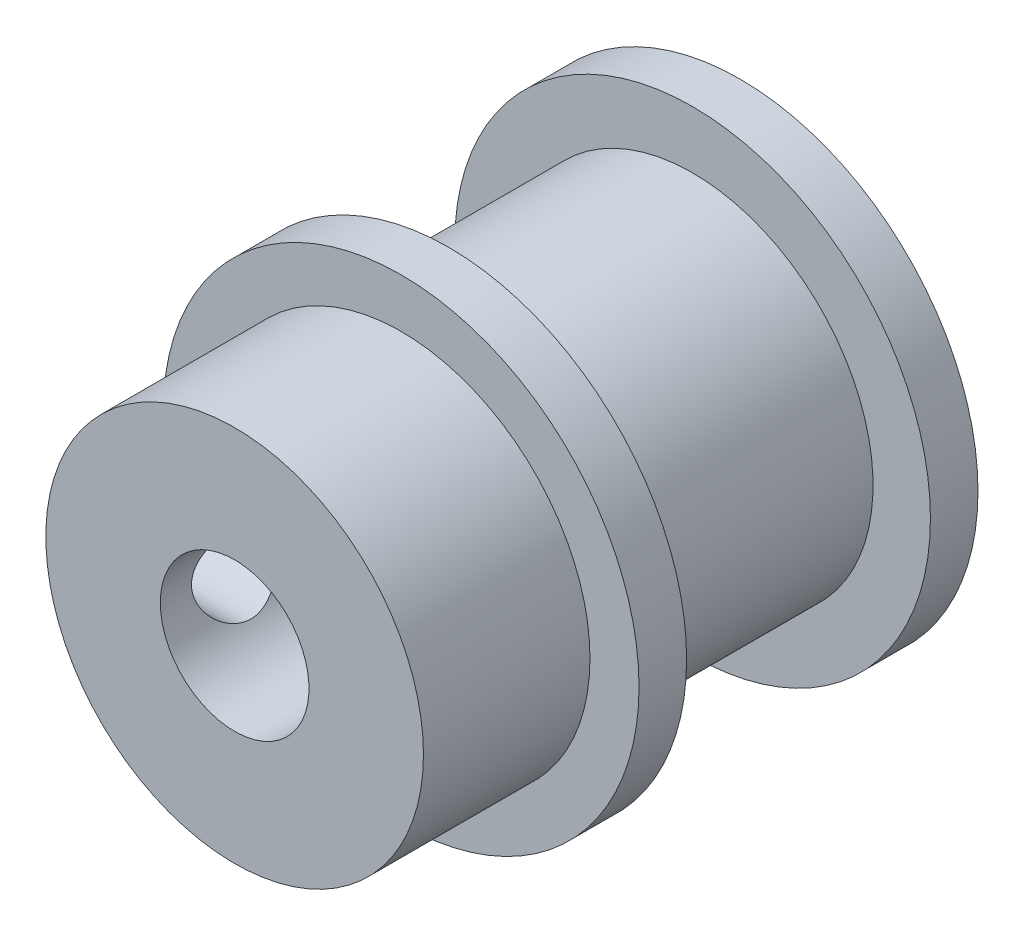
ISO-10303-21;
HEADER;
FILE_DESCRIPTION(('STEP AP214'),'2;1');
FILE_NAME('part.step','',(''),(''),'','','');
FILE_SCHEMA(('AUTOMOTIVE_DESIGN { 1 0 10303 214 1 1 1 1 }'));
ENDSEC;
DATA;
#1=APPLICATION_CONTEXT('core data for automotive mechanical design processes');
#2=APPLICATION_PROTOCOL_DEFINITION('international standard','automotive_design',2000,#1);
#3=PRODUCT_CONTEXT('',#1,'mechanical');
#4=PRODUCT('Part','Part','',(#3));
#5=PRODUCT_RELATED_PRODUCT_CATEGORY('part','',(#4));
#6=PRODUCT_DEFINITION_FORMATION('','',#4);
#7=PRODUCT_DEFINITION_CONTEXT('part definition',#1,'design');
#8=PRODUCT_DEFINITION('design','',#6,#7);
#9=PRODUCT_DEFINITION_SHAPE('','',#8);
#10=(LENGTH_UNIT() NAMED_UNIT(*) SI_UNIT(.MILLI.,.METRE.));
#11=(NAMED_UNIT(*) PLANE_ANGLE_UNIT() SI_UNIT($,.RADIAN.));
#12=(NAMED_UNIT(*) SI_UNIT($,.STERADIAN.) SOLID_ANGLE_UNIT());
#13=UNCERTAINTY_MEASURE_WITH_UNIT(LENGTH_MEASURE(1.E-05),#10,'distance_accuracy_value','');
#14=(GEOMETRIC_REPRESENTATION_CONTEXT(3) GLOBAL_UNCERTAINTY_ASSIGNED_CONTEXT((#13)) GLOBAL_UNIT_ASSIGNED_CONTEXT((#10,
#11,#12)) REPRESENTATION_CONTEXT('',''));
#15=CARTESIAN_POINT('',(0.,0.,0.));
#16=DIRECTION('',(0.,0.,1.));
#17=DIRECTION('',(1.,0.,0.));
#18=AXIS2_PLACEMENT_3D('',#15,#16,#17);
#19=CARTESIAN_POINT('',(0.,0.,11.4));
#20=DIRECTION('',(0.,0.,1.));
#21=DIRECTION('',(1.,0.,0.));
#22=AXIS2_PLACEMENT_3D('',#19,#20,#21);
#23=PLANE('',#22);
#24=CARTESIAN_POINT('',(0.,0.,11.4));
#25=DIRECTION('',(0.,0.,1.));
#26=DIRECTION('',(1.,0.,0.));
#27=AXIS2_PLACEMENT_3D('',#24,#25,#26);
#28=CIRCLE('',#27,8.);
#29=CARTESIAN_POINT('',(8.,0.,11.4));
#30=VERTEX_POINT('',#29);
#31=EDGE_CURVE('E38',#30,#30,#28,.T.);
#32=ORIENTED_EDGE('',*,*,#31,.T.);
#33=EDGE_LOOP('',(#32));
#34=FACE_BOUND('',#33,.T.);
#35=CARTESIAN_POINT('',(0.,0.,11.4));
#36=DIRECTION('',(0.,0.,1.));
#37=DIRECTION('',(1.,0.,0.));
#38=AXIS2_PLACEMENT_3D('',#35,#36,#37);
#39=CIRCLE('',#38,6.35);
#40=CARTESIAN_POINT('',(6.35,0.,11.4));
#41=VERTEX_POINT('',#40);
#42=EDGE_CURVE('E58',#41,#41,#39,.T.);
#43=ORIENTED_EDGE('',*,*,#42,.F.);
#44=EDGE_LOOP('',(#43));
#45=FACE_BOUND('',#44,.T.);
#46=ADVANCED_FACE('F31',(#34,#45),#23,.T.);
#47=CARTESIAN_POINT('',(8.,0.,9.8));
#48=DIRECTION('',(0.,0.,-1.));
#49=DIRECTION('',(-1.,0.,0.));
#50=AXIS2_PLACEMENT_3D('',#47,#48,#49);
#51=PLANE('',#50);
#52=CARTESIAN_POINT('',(0.,0.,9.8));
#53=DIRECTION('',(0.,0.,1.));
#54=DIRECTION('',(1.,0.,0.));
#55=AXIS2_PLACEMENT_3D('',#52,#53,#54);
#56=CIRCLE('',#55,8.);
#57=CARTESIAN_POINT('',(8.,0.,9.8));
#58=VERTEX_POINT('',#57);
#59=EDGE_CURVE('E10',#58,#58,#56,.T.);
#60=ORIENTED_EDGE('',*,*,#59,.F.);
#61=EDGE_LOOP('',(#60));
#62=FACE_BOUND('',#61,.T.);
#63=CARTESIAN_POINT('',(0.,0.,9.8));
#64=DIRECTION('',(0.,0.,-1.));
#65=DIRECTION('',(-1.,0.,0.));
#66=AXIS2_PLACEMENT_3D('',#63,#64,#65);
#67=CIRCLE('',#66,6.07);
#68=CARTESIAN_POINT('',(-6.07,0.,9.8));
#69=VERTEX_POINT('',#68);
#70=EDGE_CURVE('E46',#69,#69,#67,.T.);
#71=ORIENTED_EDGE('',*,*,#70,.F.);
#72=EDGE_LOOP('',(#71));
#73=FACE_BOUND('',#72,.T.);
#74=ADVANCED_FACE('F104',(#62,#73),#51,.T.);
#75=CARTESIAN_POINT('',(0.,0.,9.8));
#76=DIRECTION('',(0.,0.,1.));
#77=DIRECTION('',(1.,0.,0.));
#78=AXIS2_PLACEMENT_3D('',#75,#76,#77);
#79=CYLINDRICAL_SURFACE('',#78,8.);
#80=ORIENTED_EDGE('',*,*,#59,.T.);
#81=EDGE_LOOP('',(#80));
#82=FACE_BOUND('',#81,.T.);
#83=ORIENTED_EDGE('',*,*,#31,.F.);
#84=EDGE_LOOP('',(#83));
#85=FACE_BOUND('',#84,.T.);
#86=ADVANCED_FACE('F33',(#82,#85),#79,.T.);
#87=CARTESIAN_POINT('',(0.,0.,1.6));
#88=DIRECTION('',(0.,0.,1.));
#89=DIRECTION('',(1.,0.,0.));
#90=AXIS2_PLACEMENT_3D('',#87,#88,#89);
#91=CYLINDRICAL_SURFACE('',#90,6.07);
#92=CARTESIAN_POINT('',(0.,0.,1.6));
#93=DIRECTION('',(0.,0.,-1.));
#94=DIRECTION('',(-1.,0.,0.));
#95=AXIS2_PLACEMENT_3D('',#92,#93,#94);
#96=CIRCLE('',#95,6.07);
#97=CARTESIAN_POINT('',(-6.07,0.,1.6));
#98=VERTEX_POINT('',#97);
#99=EDGE_CURVE('E42',#98,#98,#96,.T.);
#100=ORIENTED_EDGE('',*,*,#99,.F.);
#101=EDGE_LOOP('',(#100));
#102=FACE_BOUND('',#101,.T.);
#103=ORIENTED_EDGE('',*,*,#70,.T.);
#104=EDGE_LOOP('',(#103));
#105=FACE_BOUND('',#104,.T.);
#106=ADVANCED_FACE('F112',(#102,#105),#91,.T.);
#107=CARTESIAN_POINT('',(0.,0.,1.6));
#108=DIRECTION('',(0.,0.,-1.));
#109=DIRECTION('',(-1.,0.,0.));
#110=AXIS2_PLACEMENT_3D('',#107,#108,#109);
#111=PLANE('',#110);
#112=CARTESIAN_POINT('',(0.,0.,1.6));
#113=DIRECTION('',(0.,0.,1.));
#114=DIRECTION('',(-1.,0.,0.));
#115=AXIS2_PLACEMENT_3D('',#112,#113,#114);
#116=CIRCLE('',#115,8.);
#117=CARTESIAN_POINT('',(-8.,0.,1.6));
#118=VERTEX_POINT('',#117);
#119=EDGE_CURVE('E52',#118,#118,#116,.T.);
#120=ORIENTED_EDGE('',*,*,#119,.T.);
#121=EDGE_LOOP('',(#120));
#122=FACE_BOUND('',#121,.T.);
#123=ORIENTED_EDGE('',*,*,#99,.T.);
#124=EDGE_LOOP('',(#123));
#125=FACE_BOUND('',#124,.T.);
#126=ADVANCED_FACE('F115',(#122,#125),#111,.F.);
#127=CARTESIAN_POINT('',(0.,0.,0.));
#128=DIRECTION('',(0.,0.,1.));
#129=DIRECTION('',(1.,0.,0.));
#130=AXIS2_PLACEMENT_3D('',#127,#128,#129);
#131=CYLINDRICAL_SURFACE('',#130,8.);
#132=CARTESIAN_POINT('',(0.,0.,0.));
#133=DIRECTION('',(0.,0.,1.));
#134=DIRECTION('',(-1.,0.,0.));
#135=AXIS2_PLACEMENT_3D('',#132,#133,#134);
#136=CIRCLE('',#135,8.);
#137=CARTESIAN_POINT('',(-8.,0.,0.));
#138=VERTEX_POINT('',#137);
#139=EDGE_CURVE('E50',#138,#138,#136,.T.);
#140=ORIENTED_EDGE('',*,*,#139,.T.);
#141=EDGE_LOOP('',(#140));
#142=FACE_BOUND('',#141,.T.);
#143=ORIENTED_EDGE('',*,*,#119,.F.);
#144=EDGE_LOOP('',(#143));
#145=FACE_BOUND('',#144,.T.);
#146=ADVANCED_FACE('F117',(#142,#145),#131,.T.);
#147=CARTESIAN_POINT('',(0.,0.,0.));
#148=DIRECTION('',(0.,0.,-1.));
#149=DIRECTION('',(-1.,0.,0.));
#150=AXIS2_PLACEMENT_3D('',#147,#148,#149);
#151=PLANE('',#150);
#152=CARTESIAN_POINT('',(0.,0.,0.));
#153=DIRECTION('',(0.,0.,-1.));
#154=DIRECTION('',(-1.,0.,0.));
#155=AXIS2_PLACEMENT_3D('',#152,#153,#154);
#156=CIRCLE('',#155,2.49999999999999);
#157=CARTESIAN_POINT('',(-2.49999999999999,0.,0.));
#158=VERTEX_POINT('',#157);
#159=EDGE_CURVE('E66',#158,#158,#156,.T.);
#160=ORIENTED_EDGE('',*,*,#159,.F.);
#161=EDGE_LOOP('',(#160));
#162=FACE_BOUND('',#161,.T.);
#163=ORIENTED_EDGE('',*,*,#139,.F.);
#164=EDGE_LOOP('',(#163));
#165=FACE_BOUND('',#164,.T.);
#166=ADVANCED_FACE('F100',(#162,#165),#151,.T.);
#167=CARTESIAN_POINT('',(0.,0.,17.));
#168=DIRECTION('',(0.,0.,-1.));
#169=DIRECTION('',(-1.,0.,0.));
#170=AXIS2_PLACEMENT_3D('',#167,#168,#169);
#171=CYLINDRICAL_SURFACE('',#170,6.35);
#172=CARTESIAN_POINT('',(-6.35,0.,15.9528365135193));
#173=CARTESIAN_POINT('',(-6.34999851724395,-0.0830209487421049,15.9528339366377));
#174=CARTESIAN_POINT('',(-6.34835548464635,-0.166071705542504,15.9459208040846));
#175=CARTESIAN_POINT('',(-6.34196006203195,-0.329802616773766,15.9184865242906));
#176=CARTESIAN_POINT('',(-6.33720570059271,-0.410481234262163,15.8979567490638));
#177=CARTESIAN_POINT('',(-6.32511541536286,-0.567078972002022,15.8439772061771));
#178=CARTESIAN_POINT('',(-6.31778241043488,-0.64300335974414,15.8105420424467));
#179=CARTESIAN_POINT('',(-6.3013205537597,-0.788164128517249,15.7317499598303));
#180=CARTESIAN_POINT('',(-6.29219168938457,-0.857400462514774,15.6863929571128));
#181=CARTESIAN_POINT('',(-6.27294410619427,-0.988504146075392,15.5841559740953));
#182=CARTESIAN_POINT('',(-6.26281145281055,-1.05022983067825,15.5270969405367));
#183=CARTESIAN_POINT('',(-6.24279339171246,-1.16333007962071,15.4034594223295));
#184=CARTESIAN_POINT('',(-6.23290800919793,-1.2147035926849,15.3368799720437));
#185=CARTESIAN_POINT('',(-6.21436474587978,-1.30628857858909,15.1950155590712));
#186=CARTESIAN_POINT('',(-6.20572463411779,-1.34634507695963,15.1196280157515));
#187=CARTESIAN_POINT('',(-6.19085199880808,-1.41316353749857,14.9629529123057));
#188=CARTESIAN_POINT('',(-6.18461913528442,-1.43992737714354,14.8816661872495));
#189=CARTESIAN_POINT('',(-6.1754093638889,-1.4789243640839,14.7170486009501));
#190=CARTESIAN_POINT('',(-6.17237584620284,-1.4914104910839,14.6337809072313));
#191=CARTESIAN_POINT('',(-6.16973853210434,-1.50228500188724,14.4662816667529));
#192=CARTESIAN_POINT('',(-6.17013424074105,-1.5006754201675,14.3820502608416));
#193=CARTESIAN_POINT('',(-6.17425961423211,-1.48360683567082,14.2169265525034));
#194=CARTESIAN_POINT('',(-6.17791755158493,-1.4684457767716,14.1360013840218));
#195=CARTESIAN_POINT('',(-6.18804133190497,-1.42517840490093,13.9778767861164));
#196=CARTESIAN_POINT('',(-6.19450735566558,-1.39707125841274,13.9006775969386));
#197=CARTESIAN_POINT('',(-6.20958678218059,-1.32844678458484,13.7513798697232));
#198=CARTESIAN_POINT('',(-6.21821926579501,-1.28781841151537,13.6793343815247));
#199=CARTESIAN_POINT('',(-6.23664776102026,-1.19538261640077,13.5429751507037));
#200=CARTESIAN_POINT('',(-6.24644395581355,-1.14357343330741,13.4786626285598));
#201=CARTESIAN_POINT('',(-6.26640074159939,-1.02868790517089,13.3578837785624));
#202=CARTESIAN_POINT('',(-6.27656427474606,-0.965359229076418,13.3016576832906));
#203=CARTESIAN_POINT('',(-6.29588562944104,-0.830052536460324,13.2005810109286));
#204=CARTESIAN_POINT('',(-6.30504342639666,-0.758074308526314,13.155730711969));
#205=CARTESIAN_POINT('',(-6.32135942493142,-0.607191614109492,13.0786038851033));
#206=CARTESIAN_POINT('',(-6.32851195395597,-0.528268312455402,13.0463629272039));
#207=CARTESIAN_POINT('',(-6.33996993682454,-0.365916560598579,12.9956702108494));
#208=CARTESIAN_POINT('',(-6.34427587535181,-0.282488879965401,12.9772161048651));
#209=CARTESIAN_POINT('',(-6.34948503249582,-0.115553538980352,12.9549798275075));
#210=CARTESIAN_POINT('',(-6.35046421324579,-0.0320918238016502,12.9508700612716));
#211=CARTESIAN_POINT('',(-6.34912429021221,0.134326079532355,12.9565454456191));
#212=CARTESIAN_POINT('',(-6.34680544961474,0.217282307495616,12.9663294874597));
#213=CARTESIAN_POINT('',(-6.33917838174839,0.37922016985958,12.9992438951182));
#214=CARTESIAN_POINT('',(-6.33390950352625,0.458239510996913,13.0221986809419));
#215=CARTESIAN_POINT('',(-6.32097400029951,0.611304086387359,13.0806050138535));
#216=CARTESIAN_POINT('',(-6.31330714919518,0.685348850798215,13.1160577393855));
#217=CARTESIAN_POINT('',(-6.29624149651372,0.827689304318969,13.1991100651196));
#218=CARTESIAN_POINT('',(-6.28681663475878,0.895872345524981,13.2468972492251));
#219=CARTESIAN_POINT('',(-6.26732668110161,1.02336854827638,13.3530189840094));
#220=CARTESIAN_POINT('',(-6.25726149136242,1.08268034970591,13.4113551490085));
#221=CARTESIAN_POINT('',(-6.23735679650375,1.19207580420076,13.5384324966406));
#222=CARTESIAN_POINT('',(-6.22752694929493,1.24193090389247,13.6073722471142));
#223=CARTESIAN_POINT('',(-6.20945265145426,1.32936029211664,13.7528359354712));
#224=CARTESIAN_POINT('',(-6.2012081299286,1.36693512985993,13.8293595339822));
#225=CARTESIAN_POINT('',(-6.18732408481131,1.42846636533289,13.9874008455852));
#226=CARTESIAN_POINT('',(-6.18166930794986,1.45250270111901,14.068886027581));
#227=CARTESIAN_POINT('',(-6.17358371023307,1.48649761919311,14.234892392102));
#228=CARTESIAN_POINT('',(-6.17115227288946,1.49645889346788,14.3194129909035));
#229=CARTESIAN_POINT('',(-6.16983199335337,1.50189189090822,14.4867753920578));
#230=CARTESIAN_POINT('',(-6.17085418392761,1.49772748776162,14.5696048805866));
#231=CARTESIAN_POINT('',(-6.17612233302335,1.47585131759939,14.7333452390736));
#232=CARTESIAN_POINT('',(-6.18036823966433,1.45813976860322,14.8142561398869));
#233=CARTESIAN_POINT('',(-6.19155859321837,1.40986066978044,14.9715155299881));
#234=CARTESIAN_POINT('',(-6.198490161484,1.37935441810503,15.0478838163832));
#235=CARTESIAN_POINT('',(-6.21427398682872,1.30640175172683,15.1944693506775));
#236=CARTESIAN_POINT('',(-6.22312648105611,1.26395386257482,15.2646858376014));
#237=CARTESIAN_POINT('',(-6.24201391004488,1.16715206254848,15.3987493003044));
#238=CARTESIAN_POINT('',(-6.25207168946107,1.11254249880654,15.4624084947976));
#239=CARTESIAN_POINT('',(-6.27209257501468,0.993474944889205,15.5797781706955));
#240=CARTESIAN_POINT('',(-6.28205565844781,0.929014653170159,15.6334863206135));
#241=CARTESIAN_POINT('',(-6.30095070373692,0.790855077532081,15.7302448497052));
#242=CARTESIAN_POINT('',(-6.30986403352165,0.717026696497846,15.7731147766827));
#243=CARTESIAN_POINT('',(-6.32546353967866,0.563011253816946,15.8457672103146));
#244=CARTESIAN_POINT('',(-6.33215143699731,0.482829165239743,15.8755598354773));
#245=CARTESIAN_POINT('',(-6.34146337323501,0.335568702357189,15.9163801483638));
#246=CARTESIAN_POINT('',(-6.3446436242047,0.269238102345869,15.9300233605788));
#247=CARTESIAN_POINT('',(-6.34891247920239,0.135278213529583,15.9482523224271));
#248=CARTESIAN_POINT('',(-6.35000120821274,0.0676490025691895,15.9528386132721));
#249=CARTESIAN_POINT('',(-6.35,0.,15.9528365135193));
#250=B_SPLINE_CURVE_WITH_KNOTS('',3,(#172,#173,#174,#175,#176,#177,#178,#179,#180,#181,#182,
#183,#184,#185,#186,#187,#188,#189,#190,#191,#192,#193,#194,#195,#196,#197,#198,#199,#200,#201,
#202,#203,#204,#205,#206,#207,#208,#209,#210,#211,#212,#213,#214,#215,#216,#217,#218,#219,#220,
#221,#222,#223,#224,#225,#226,#227,#228,#229,#230,#231,#232,#233,#234,#235,#236,#237,#238,#239,
#240,#241,#242,#243,#244,#245,#246,#247,#248,#249),.UNSPECIFIED.,.T.,.F.,(4,2,2,2,2,2,2,2,2,2,2,
2,2,2,2,2,2,2,2,2,2,2,2,2,2,2,2,2,2,2,2,2,2,2,2,2,2,2,4),(0.,0.248815070913741,
0.497787950658722,0.746479911109805,0.995173620349715,1.24800235932538,1.50085676043725,
1.757022250971,2.01315154998106,2.26466865776916,2.51614946391931,2.76223359968084,
3.00833358145961,3.25668218758357,3.50506993876881,3.75975438391659,4.01444505532945,
4.26984909538286,4.52520963709544,4.7746986858651,5.02416782622494,5.27038608564856,
5.51662756746634,5.76686059612934,6.01713195064175,6.27284210654467,6.52854082474262,
6.78271350366642,7.03683756311166,7.28446569177382,7.53208983534428,7.77854094830847,
8.02502250427127,8.27727905299747,8.52959462980916,8.78586924469394,9.04194521710609,
9.24470244341193,9.44744755324901),.UNSPECIFIED.);
#251=CARTESIAN_POINT('',(-6.35,0.,15.9528365135193));
#252=VERTEX_POINT('',#251);
#253=EDGE_CURVE('E69',#252,#252,#250,.T.);
#254=ORIENTED_EDGE('',*,*,#253,.T.);
#255=EDGE_LOOP('',(#254));
#256=FACE_BOUND('',#255,.T.);
#257=CARTESIAN_POINT('',(0.,0.,17.));
#258=DIRECTION('',(0.,0.,1.));
#259=DIRECTION('',(1.,0.,0.));
#260=AXIS2_PLACEMENT_3D('',#257,#258,#259);
#261=CIRCLE('',#260,6.35);
#262=CARTESIAN_POINT('',(6.35,0.,17.));
#263=VERTEX_POINT('',#262);
#264=EDGE_CURVE('E55',#263,#263,#261,.T.);
#265=ORIENTED_EDGE('',*,*,#264,.F.);
#266=EDGE_LOOP('',(#265));
#267=FACE_BOUND('',#266,.T.);
#268=ORIENTED_EDGE('',*,*,#42,.T.);
#269=EDGE_LOOP('',(#268));
#270=FACE_BOUND('',#269,.T.);
#271=ADVANCED_FACE('F80',(#256,#267,#270),#171,.T.);
#272=CARTESIAN_POINT('',(0.,0.,17.));
#273=DIRECTION('',(0.,0.,1.));
#274=DIRECTION('',(1.,0.,0.));
#275=AXIS2_PLACEMENT_3D('',#272,#273,#274);
#276=PLANE('',#275);
#277=CARTESIAN_POINT('',(0.,0.,17.));
#278=DIRECTION('',(0.,0.,-1.));
#279=DIRECTION('',(-1.,0.,0.));
#280=AXIS2_PLACEMENT_3D('',#277,#278,#279);
#281=CIRCLE('',#280,2.49999999999999);
#282=CARTESIAN_POINT('',(-2.49999999999999,0.,17.));
#283=VERTEX_POINT('',#282);
#284=EDGE_CURVE('E61',#283,#283,#281,.T.);
#285=ORIENTED_EDGE('',*,*,#284,.T.);
#286=EDGE_LOOP('',(#285));
#287=FACE_BOUND('',#286,.T.);
#288=ORIENTED_EDGE('',*,*,#264,.T.);
#289=EDGE_LOOP('',(#288));
#290=FACE_BOUND('',#289,.T.);
#291=ADVANCED_FACE('F93',(#287,#290),#276,.T.);
#292=CARTESIAN_POINT('',(0.,0.,0.));
#293=DIRECTION('',(0.,0.,-1.));
#294=DIRECTION('',(-1.,0.,0.));
#295=AXIS2_PLACEMENT_3D('',#292,#293,#294);
#296=CYLINDRICAL_SURFACE('',#295,2.49999999999999);
#297=CARTESIAN_POINT('',(-2.49999999999999,0.,15.9528365135193));
#298=CARTESIAN_POINT('',(-2.49999625789731,0.0767298334620154,15.9528324225094));
#299=CARTESIAN_POINT('',(-2.49642904615008,0.153582320644177,15.946907842593));
#300=CARTESIAN_POINT('',(-2.48249903608566,0.304975509530677,15.923512194004));
#301=CARTESIAN_POINT('',(-2.47211948032717,0.379510034596045,15.9060126516651));
#302=CARTESIAN_POINT('',(-2.44561558054487,0.523751827790834,15.8604501523524));
#303=CARTESIAN_POINT('',(-2.42951973272942,0.593481028226563,15.8324395553561));
#304=CARTESIAN_POINT('',(-2.39295367626406,0.727030318214655,15.7669761803783));
#305=CARTESIAN_POINT('',(-2.37248455380254,0.790851869416379,15.7295257465505));
#306=CARTESIAN_POINT('',(-2.32705360719086,0.91629927899931,15.6430616868107));
#307=CARTESIAN_POINT('',(-2.30186792195984,0.97738402008141,15.5933828181679));
#308=CARTESIAN_POINT('',(-2.25030439279632,1.0908827041189,15.485369309691));
#309=CARTESIAN_POINT('',(-2.22392505153569,1.14328534948112,15.427023576332));
#310=CARTESIAN_POINT('',(-2.16911066995909,1.24444996762973,15.2949130030226));
#311=CARTESIAN_POINT('',(-2.14082017703648,1.29197766378808,15.220134742538));
#312=CARTESIAN_POINT('',(-2.08938301412123,1.37361437764896,15.0619899402762));
#313=CARTESIAN_POINT('',(-2.06622802273936,1.40774517335159,14.9786376172717));
#314=CARTESIAN_POINT('',(-2.03354629660929,1.45440601714221,14.8262400628661));
#315=CARTESIAN_POINT('',(-2.0220788313759,1.47016197246826,14.758600514909));
#316=CARTESIAN_POINT('',(-2.00590308295502,1.49216172340474,14.6210327976889));
#317=CARTESIAN_POINT('',(-2.00118639643758,1.49841734556835,14.5511075847648));
#318=CARTESIAN_POINT('',(-1.99920922463855,1.50105508796008,14.410825019302));
#319=CARTESIAN_POINT('',(-2.00196337012717,1.49741783408418,14.3404670884261));
#320=CARTESIAN_POINT('',(-2.0145326144374,1.48046060478827,14.2015577380917));
#321=CARTESIAN_POINT('',(-2.02435302432225,1.46713334620102,14.1330077176719));
#322=CARTESIAN_POINT('',(-2.04953186944257,1.43173921881792,14.0003062713912));
#323=CARTESIAN_POINT('',(-2.06481711652536,1.40978748666086,13.9361094595948));
#324=CARTESIAN_POINT('',(-2.09927051350827,1.35795061770836,13.8121415225912));
#325=CARTESIAN_POINT('',(-2.11844008623464,1.32806257259704,13.7523720300954));
#326=CARTESIAN_POINT('',(-2.16255327268984,1.25517983184582,13.6278524163965));
#327=CARTESIAN_POINT('',(-2.18792043372991,1.21080724397722,13.5640584205644));
#328=CARTESIAN_POINT('',(-2.2393059976438,1.11291092784003,13.4441600298523));
#329=CARTESIAN_POINT('',(-2.26532500262148,1.05937845100578,13.3880630795428));
#330=CARTESIAN_POINT('',(-2.31935504958315,0.935811834382963,13.2772235316976));
#331=CARTESIAN_POINT('',(-2.34713836268531,0.864517682704955,13.2237592075033));
#332=CARTESIAN_POINT('',(-2.39772428433979,0.712276050458999,13.1297144663214));
#333=CARTESIAN_POINT('',(-2.42052955425514,0.631333763943563,13.0891271597294));
#334=CARTESIAN_POINT('',(-2.4573039206615,0.467197585268206,13.0249043307234));
#335=CARTESIAN_POINT('',(-2.47173957439702,0.384467624173581,13.0003611578034));
#336=CARTESIAN_POINT('',(-2.49218842813549,0.215047895144641,12.9658253161139));
#337=CARTESIAN_POINT('',(-2.49821172952736,0.128363005661321,12.9558151957657));
#338=CARTESIAN_POINT('',(-2.50090570374609,-0.0337146143773941,12.951328665841));
#339=CARTESIAN_POINT('',(-2.49873521714284,-0.109042473418715,12.9549276584341));
#340=CARTESIAN_POINT('',(-2.48778712087047,-0.257829401986057,12.9732623665912));
#341=CARTESIAN_POINT('',(-2.47900964518036,-0.331288509376102,12.9879978563251));
#342=CARTESIAN_POINT('',(-2.45594792442189,-0.472574932157609,13.0273799463318));
#343=CARTESIAN_POINT('',(-2.44180275662554,-0.54049575092848,13.0517768625928));
#344=CARTESIAN_POINT('',(-2.40913880862843,-0.671265749087258,13.1095138898846));
#345=CARTESIAN_POINT('',(-2.3906191658651,-0.734113924963903,13.142855764866));
#346=CARTESIAN_POINT('',(-2.34845496237359,-0.860006262823857,13.221393492728));
#347=CARTESIAN_POINT('',(-2.32447802739879,-0.922394150456831,13.2674603425977));
#348=CARTESIAN_POINT('',(-2.2747426557473,-1.03902603131013,13.3682279070079));
#349=CARTESIAN_POINT('',(-2.24898216586359,-1.09326040273737,13.4229386683718));
#350=CARTESIAN_POINT('',(-2.1944542390989,-1.19931996735578,13.5477469035565));
#351=CARTESIAN_POINT('',(-2.1657324174629,-1.24991019630914,13.6189203989848));
#352=CARTESIAN_POINT('',(-2.11216182066709,-1.33845238915667,13.7700525380875));
#353=CARTESIAN_POINT('',(-2.08730897997689,-1.3764176676978,13.8500018074121));
#354=CARTESIAN_POINT('',(-2.04984909240518,-1.43142578795776,13.999079535826));
#355=CARTESIAN_POINT('',(-2.03575659328728,-1.45121625336189,14.0668168258779));
#356=CARTESIAN_POINT('',(-2.01409605743543,-1.48113663905971,14.2053685915994));
#357=CARTESIAN_POINT('',(-2.0065189764272,-1.4912799529763,14.2761786578471));
#358=CARTESIAN_POINT('',(-1.99900446616266,-1.5013413041663,14.4192134611163));
#359=CARTESIAN_POINT('',(-1.99909576445936,-1.50122089107868,14.4914425042063));
#360=CARTESIAN_POINT('',(-2.00697717892849,-1.49066472959327,14.6347309491288));
#361=CARTESIAN_POINT('',(-2.01477148138819,-1.48022337215758,14.7057896935999));
#362=CARTESIAN_POINT('',(-2.03633185242979,-1.45040174148912,14.8413249310915));
#363=CARTESIAN_POINT('',(-2.04979211805579,-1.43147636845351,14.9059536078262));
#364=CARTESIAN_POINT('',(-2.0810550196015,-1.38563242076993,15.0311737679935));
#365=CARTESIAN_POINT('',(-2.09885929040481,-1.35871083588479,15.0917637204798));
#366=CARTESIAN_POINT('',(-2.14012990550915,-1.29289245555732,15.2171563707401));
#367=CARTESIAN_POINT('',(-2.16404587582638,-1.25279167675753,15.2811776173736));
#368=CARTESIAN_POINT('',(-2.21320127030766,-1.16375698389084,15.4022165861366));
#369=CARTESIAN_POINT('',(-2.2384417720502,-1.11481579607798,15.4592284756718));
#370=CARTESIAN_POINT('',(-2.29225690291475,-1.00009777425734,15.574187462651));
#371=CARTESIAN_POINT('',(-2.32070308663656,-0.932876819313904,15.6307675884155));
#372=CARTESIAN_POINT('',(-2.37365428872366,-0.78846243444559,15.7319343693826));
#373=CARTESIAN_POINT('',(-2.39815789310934,-0.711265444501542,15.7765167255041));
#374=CARTESIAN_POINT('',(-2.43985578654393,-0.551125230801458,15.850622321093));
#375=CARTESIAN_POINT('',(-2.45725077479785,-0.468430086957218,15.8805645784461));
#376=CARTESIAN_POINT('',(-2.48366273001244,-0.297973306118812,15.9255612087303));
#377=CARTESIAN_POINT('',(-2.49271125871484,-0.210232099648617,15.9406716813763));
#378=CARTESIAN_POINT('',(-2.49802001168185,-0.10155809691754,15.949533968228));
#379=CARTESIAN_POINT('',(-2.4987611465636,-0.0812762590282812,15.9507709308254));
#380=CARTESIAN_POINT('',(-2.49975164517365,-0.0406658206871146,15.9524227598902));
#381=CARTESIAN_POINT('',(-2.50000099184314,-0.0203372186375705,15.9528375978402));
#382=CARTESIAN_POINT('',(-2.49999999999999,0.,15.9528365135193));
#383=B_SPLINE_CURVE_WITH_KNOTS('',3,(#297,#298,#299,#300,#301,#302,#303,#304,#305,#306,#307,
#308,#309,#310,#311,#312,#313,#314,#315,#316,#317,#318,#319,#320,#321,#322,#323,#324,#325,#326,
#327,#328,#329,#330,#331,#332,#333,#334,#335,#336,#337,#338,#339,#340,#341,#342,#343,#344,#345,
#346,#347,#348,#349,#350,#351,#352,#353,#354,#355,#356,#357,#358,#359,#360,#361,#362,#363,#364,
#365,#366,#367,#368,#369,#370,#371,#372,#373,#374,#375,#376,#377,#378,#379,#380,#381,#382),
.UNSPECIFIED.,.T.,.F.,(4,2,2,2,2,2,2,2,2,2,2,2,2,2,2,2,2,2,2,2,2,2,2,2,2,2,2,2,2,2,2,2,2,2,2,2,
2,2,2,2,2,2,4),(0.,0.230102237548648,0.460772627520009,0.690308884600008,0.919788197992271,
1.16681590732472,1.414162579348,1.69183813189806,1.96906040692091,2.17933829855632,
2.38935420916577,2.59978170870724,2.81036753273871,3.01823267593205,3.22617409809867,
3.47046995225161,3.71500044803672,3.99360957884689,4.27206939275322,4.53296790696557,
4.79355286918233,5.01875602722424,5.24395461863452,5.46367785689769,5.68344445659022,
5.92601365818359,6.16886690081833,6.44336762428006,6.71757792616452,6.93257787314689,
7.14727888733315,7.36278425777429,7.57840681155721,7.78364098331138,7.98895251523031,
8.22578610052281,8.46281544370203,8.73854311775514,9.0143694603198,9.28175654462672,
9.54812832184443,9.60911473335172,9.67010326027636),.UNSPECIFIED.);
#384=CARTESIAN_POINT('',(-2.49999999999999,0.,15.9528365135193));
#385=VERTEX_POINT('',#384);
#386=EDGE_CURVE('E76',#385,#385,#383,.T.);
#387=ORIENTED_EDGE('',*,*,#386,.T.);
#388=EDGE_LOOP('',(#387));
#389=FACE_BOUND('',#388,.T.);
#390=ORIENTED_EDGE('',*,*,#284,.F.);
#391=EDGE_LOOP('',(#390));
#392=FACE_BOUND('',#391,.T.);
#393=ORIENTED_EDGE('',*,*,#159,.T.);
#394=EDGE_LOOP('',(#393));
#395=FACE_BOUND('',#394,.T.);
#396=ADVANCED_FACE('F87',(#389,#392,#395),#296,.F.);
#397=CARTESIAN_POINT('',(-6.35,0.,14.4528365135193));
#398=DIRECTION('',(-1.,0.,0.));
#399=DIRECTION('',(0.,0.,1.));
#400=AXIS2_PLACEMENT_3D('',#397,#398,#399);
#401=CYLINDRICAL_SURFACE('',#400,1.49999999999999);
#402=ORIENTED_EDGE('',*,*,#386,.F.);
#403=EDGE_LOOP('',(#402));
#404=FACE_BOUND('',#403,.T.);
#405=ORIENTED_EDGE('',*,*,#253,.F.);
#406=EDGE_LOOP('',(#405));
#407=FACE_BOUND('',#406,.T.);
#408=ADVANCED_FACE('F84',(#404,#407),#401,.F.);
#409=CLOSED_SHELL('',(#46,#74,#86,#106,#126,#146,#166,#271,#291,#396,#408));
#410=MANIFOLD_SOLID_BREP('B2',#409);
#411=ADVANCED_BREP_SHAPE_REPRESENTATION('',(#18,#410),#14);
#412=SHAPE_DEFINITION_REPRESENTATION(#9,#411);
ENDSEC;
END-ISO-10303-21;
